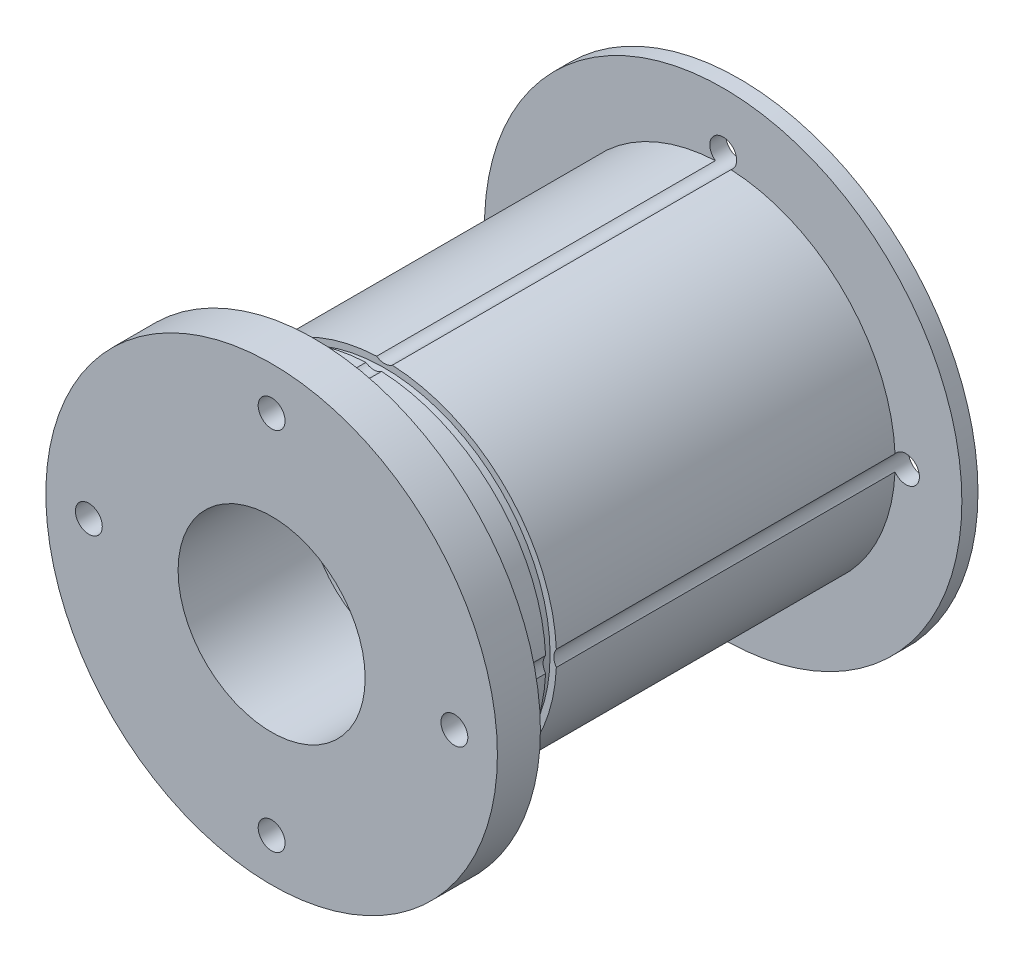
ISO-10303-21;
HEADER;
FILE_DESCRIPTION(('STEP AP214'),'2;1');
FILE_NAME('part.step','',(''),(''),'','','');
FILE_SCHEMA(('AUTOMOTIVE_DESIGN { 1 0 10303 214 1 1 1 1 }'));
ENDSEC;
DATA;
#1=APPLICATION_CONTEXT('core data for automotive mechanical design processes');
#2=APPLICATION_PROTOCOL_DEFINITION('international standard','automotive_design',2000,#1);
#3=PRODUCT_CONTEXT('',#1,'mechanical');
#4=PRODUCT('Part','Part','',(#3));
#5=PRODUCT_RELATED_PRODUCT_CATEGORY('part','',(#4));
#6=PRODUCT_DEFINITION_FORMATION('','',#4);
#7=PRODUCT_DEFINITION_CONTEXT('part definition',#1,'design');
#8=PRODUCT_DEFINITION('design','',#6,#7);
#9=PRODUCT_DEFINITION_SHAPE('','',#8);
#10=(LENGTH_UNIT() NAMED_UNIT(*) SI_UNIT(.MILLI.,.METRE.));
#11=(NAMED_UNIT(*) PLANE_ANGLE_UNIT() SI_UNIT($,.RADIAN.));
#12=(NAMED_UNIT(*) SI_UNIT($,.STERADIAN.) SOLID_ANGLE_UNIT());
#13=UNCERTAINTY_MEASURE_WITH_UNIT(LENGTH_MEASURE(1.E-05),#10,'distance_accuracy_value','');
#14=(GEOMETRIC_REPRESENTATION_CONTEXT(3) GLOBAL_UNCERTAINTY_ASSIGNED_CONTEXT((#13)) GLOBAL_UNIT_ASSIGNED_CONTEXT((#10,
#11,#12)) REPRESENTATION_CONTEXT('',''));
#15=CARTESIAN_POINT('',(0.,0.,0.));
#16=DIRECTION('',(0.,0.,1.));
#17=DIRECTION('',(1.,0.,0.));
#18=AXIS2_PLACEMENT_3D('',#15,#16,#17);
#19=CARTESIAN_POINT('',(0.,0.,23.));
#20=DIRECTION('',(0.,0.,-1.));
#21=DIRECTION('',(-1.,0.,0.));
#22=AXIS2_PLACEMENT_3D('',#19,#20,#21);
#23=CYLINDRICAL_SURFACE('',#22,16.);
#24=CARTESIAN_POINT('',(0.,0.,-15.));
#25=DIRECTION('',(0.,0.,1.));
#26=DIRECTION('',(1.,0.,0.));
#27=AXIS2_PLACEMENT_3D('',#24,#25,#26);
#28=CIRCLE('',#27,16.);
#29=CARTESIAN_POINT('',(0.727418763077474,-15.9834558823529,-15.));
#30=VERTEX_POINT('',#29);
#31=CARTESIAN_POINT('',(15.9834558823529,-0.727418763077469,-15.));
#32=VERTEX_POINT('',#31);
#33=EDGE_CURVE('E238',#30,#32,#28,.T.);
#34=ORIENTED_EDGE('',*,*,#33,.T.);
#35=DIRECTION('',(0.,0.,1.));
#36=VECTOR('',#35,1.);
#37=CARTESIAN_POINT('',(15.9834558823529,-0.727418763077475,0.));
#38=LINE('',#37,#36);
#39=CARTESIAN_POINT('',(15.9834558823529,-0.727418763077475,16.5));
#40=VERTEX_POINT('',#39);
#41=EDGE_CURVE('E232',#32,#40,#38,.T.);
#42=ORIENTED_EDGE('',*,*,#41,.T.);
#43=CARTESIAN_POINT('',(0.,0.,16.5));
#44=DIRECTION('',(0.,0.,1.));
#45=DIRECTION('',(1.,0.,0.));
#46=AXIS2_PLACEMENT_3D('',#43,#44,#45);
#47=CIRCLE('',#46,16.);
#48=CARTESIAN_POINT('',(0.727418763077472,-15.9834558823529,16.5));
#49=VERTEX_POINT('',#48);
#50=EDGE_CURVE('E184',#49,#40,#47,.T.);
#51=ORIENTED_EDGE('',*,*,#50,.F.);
#52=DIRECTION('',(0.,0.,1.));
#53=VECTOR('',#52,1.);
#54=CARTESIAN_POINT('',(0.727418763077471,-15.9834558823529,0.));
#55=LINE('',#54,#53);
#56=EDGE_CURVE('E157',#49,#30,#55,.F.);
#57=ORIENTED_EDGE('',*,*,#56,.T.);
#58=EDGE_LOOP('',(#34,#42,#51,#57));
#59=FACE_BOUND('',#58,.T.);
#60=ADVANCED_FACE('F38',(#59),#23,.T.);
#61=CARTESIAN_POINT('',(15.9834558823529,0.727418763077475,16.5));
#62=VERTEX_POINT('',#61);
#63=CARTESIAN_POINT('',(0.727418763077476,15.9834558823529,16.5));
#64=VERTEX_POINT('',#63);
#65=EDGE_CURVE('E189',#62,#64,#47,.T.);
#66=ORIENTED_EDGE('',*,*,#65,.F.);
#67=DIRECTION('',(0.,0.,1.));
#68=VECTOR('',#67,1.);
#69=CARTESIAN_POINT('',(15.9834558823529,0.727418763077475,0.));
#70=LINE('',#69,#68);
#71=CARTESIAN_POINT('',(15.9834558823529,0.727418763077473,-15.));
#72=VERTEX_POINT('',#71);
#73=EDGE_CURVE('E234',#62,#72,#70,.F.);
#74=ORIENTED_EDGE('',*,*,#73,.T.);
#75=CARTESIAN_POINT('',(0.727418763077473,15.9834558823529,-15.));
#76=VERTEX_POINT('',#75);
#77=EDGE_CURVE('E224',#72,#76,#28,.T.);
#78=ORIENTED_EDGE('',*,*,#77,.T.);
#79=DIRECTION('',(0.,0.,1.));
#80=VECTOR('',#79,1.);
#81=CARTESIAN_POINT('',(0.727418763077475,15.9834558823529,0.));
#82=LINE('',#81,#80);
#83=EDGE_CURVE('E213',#76,#64,#82,.T.);
#84=ORIENTED_EDGE('',*,*,#83,.T.);
#85=EDGE_LOOP('',(#66,#74,#78,#84));
#86=FACE_BOUND('',#85,.T.);
#87=ADVANCED_FACE('F221',(#86),#23,.T.);
#88=CARTESIAN_POINT('',(-0.727418763077474,15.9834558823529,16.5));
#89=VERTEX_POINT('',#88);
#90=CARTESIAN_POINT('',(-15.9834558823529,0.727418763077477,16.5));
#91=VERTEX_POINT('',#90);
#92=EDGE_CURVE('E183',#89,#91,#47,.T.);
#93=ORIENTED_EDGE('',*,*,#92,.F.);
#94=DIRECTION('',(0.,0.,1.));
#95=VECTOR('',#94,1.);
#96=CARTESIAN_POINT('',(-0.727418763077473,15.9834558823529,0.));
#97=LINE('',#96,#95);
#98=CARTESIAN_POINT('',(-0.727418763077472,15.9834558823529,-15.));
#99=VERTEX_POINT('',#98);
#100=EDGE_CURVE('E216',#89,#99,#97,.F.);
#101=ORIENTED_EDGE('',*,*,#100,.T.);
#102=CARTESIAN_POINT('',(-15.9834558823529,0.727418763077477,-15.));
#103=VERTEX_POINT('',#102);
#104=EDGE_CURVE('E319',#99,#103,#28,.T.);
#105=ORIENTED_EDGE('',*,*,#104,.T.);
#106=DIRECTION('',(0.,0.,1.));
#107=VECTOR('',#106,1.);
#108=CARTESIAN_POINT('',(-15.9834558823529,0.727418763077477,0.));
#109=LINE('',#108,#107);
#110=EDGE_CURVE('E439',#103,#91,#109,.T.);
#111=ORIENTED_EDGE('',*,*,#110,.T.);
#112=EDGE_LOOP('',(#93,#101,#105,#111));
#113=FACE_BOUND('',#112,.T.);
#114=ADVANCED_FACE('F367',(#113),#23,.T.);
#115=CARTESIAN_POINT('',(0.,0.,17.5));
#116=DIRECTION('',(0.,0.,1.));
#117=DIRECTION('',(1.,0.,0.));
#118=AXIS2_PLACEMENT_3D('',#115,#116,#117);
#119=CIRCLE('',#118,16.);
#120=CARTESIAN_POINT('',(0.727418763077472,-15.9834558823529,17.5));
#121=VERTEX_POINT('',#120);
#122=CARTESIAN_POINT('',(15.9834558823529,-0.727418763077475,17.5));
#123=VERTEX_POINT('',#122);
#124=EDGE_CURVE('E196',#121,#123,#119,.T.);
#125=ORIENTED_EDGE('',*,*,#124,.T.);
#126=DIRECTION('',(0.,0.,1.));
#127=VECTOR('',#126,1.);
#128=CARTESIAN_POINT('',(15.9834558823529,-0.727418763077475,0.));
#129=LINE('',#128,#127);
#130=CARTESIAN_POINT('',(15.9834558823529,-0.727418763077469,23.));
#131=VERTEX_POINT('',#130);
#132=EDGE_CURVE('E54',#123,#131,#129,.T.);
#133=ORIENTED_EDGE('',*,*,#132,.T.);
#134=CARTESIAN_POINT('',(0.,0.,23.));
#135=DIRECTION('',(0.,0.,1.));
#136=DIRECTION('',(1.,0.,0.));
#137=AXIS2_PLACEMENT_3D('',#134,#135,#136);
#138=CIRCLE('',#137,16.);
#139=CARTESIAN_POINT('',(0.727418763077474,-15.9834558823529,23.));
#140=VERTEX_POINT('',#139);
#141=EDGE_CURVE('E318',#140,#131,#138,.T.);
#142=ORIENTED_EDGE('',*,*,#141,.F.);
#143=DIRECTION('',(0.,0.,1.));
#144=VECTOR('',#143,1.);
#145=CARTESIAN_POINT('',(0.727418763077471,-15.9834558823529,0.));
#146=LINE('',#145,#144);
#147=EDGE_CURVE('E412',#140,#121,#146,.F.);
#148=ORIENTED_EDGE('',*,*,#147,.T.);
#149=EDGE_LOOP('',(#125,#133,#142,#148));
#150=FACE_BOUND('',#149,.T.);
#151=ADVANCED_FACE('F385',(#150),#23,.T.);
#152=CARTESIAN_POINT('',(15.9834558823529,0.727418763077473,23.));
#153=VERTEX_POINT('',#152);
#154=CARTESIAN_POINT('',(0.727418763077473,15.9834558823529,23.));
#155=VERTEX_POINT('',#154);
#156=EDGE_CURVE('E164',#153,#155,#138,.T.);
#157=ORIENTED_EDGE('',*,*,#156,.F.);
#158=DIRECTION('',(0.,0.,1.));
#159=VECTOR('',#158,1.);
#160=CARTESIAN_POINT('',(15.9834558823529,0.727418763077475,0.));
#161=LINE('',#160,#159);
#162=CARTESIAN_POINT('',(15.9834558823529,0.727418763077475,17.5));
#163=VERTEX_POINT('',#162);
#164=EDGE_CURVE('E254',#153,#163,#161,.F.);
#165=ORIENTED_EDGE('',*,*,#164,.T.);
#166=CARTESIAN_POINT('',(0.727418763077476,15.9834558823529,17.5));
#167=VERTEX_POINT('',#166);
#168=EDGE_CURVE('E199',#163,#167,#119,.T.);
#169=ORIENTED_EDGE('',*,*,#168,.T.);
#170=DIRECTION('',(0.,0.,1.));
#171=VECTOR('',#170,1.);
#172=CARTESIAN_POINT('',(0.727418763077475,15.9834558823529,0.));
#173=LINE('',#172,#171);
#174=EDGE_CURVE('E462',#167,#155,#173,.T.);
#175=ORIENTED_EDGE('',*,*,#174,.T.);
#176=EDGE_LOOP('',(#157,#165,#169,#175));
#177=FACE_BOUND('',#176,.T.);
#178=ADVANCED_FACE('F380',(#177),#23,.T.);
#179=CARTESIAN_POINT('',(-0.727418763077472,15.9834558823529,23.));
#180=VERTEX_POINT('',#179);
#181=CARTESIAN_POINT('',(-15.9834558823529,0.727418763077477,23.));
#182=VERTEX_POINT('',#181);
#183=EDGE_CURVE('E323',#180,#182,#138,.T.);
#184=ORIENTED_EDGE('',*,*,#183,.F.);
#185=DIRECTION('',(0.,0.,1.));
#186=VECTOR('',#185,1.);
#187=CARTESIAN_POINT('',(-0.727418763077473,15.9834558823529,0.));
#188=LINE('',#187,#186);
#189=CARTESIAN_POINT('',(-0.727418763077474,15.9834558823529,17.5));
#190=VERTEX_POINT('',#189);
#191=EDGE_CURVE('E392',#180,#190,#188,.F.);
#192=ORIENTED_EDGE('',*,*,#191,.T.);
#193=CARTESIAN_POINT('',(-15.9834558823529,0.727418763077477,17.5));
#194=VERTEX_POINT('',#193);
#195=EDGE_CURVE('E203',#190,#194,#119,.T.);
#196=ORIENTED_EDGE('',*,*,#195,.T.);
#197=DIRECTION('',(0.,0.,1.));
#198=VECTOR('',#197,1.);
#199=CARTESIAN_POINT('',(-15.9834558823529,0.727418763077477,0.));
#200=LINE('',#199,#198);
#201=EDGE_CURVE('E394',#194,#182,#200,.T.);
#202=ORIENTED_EDGE('',*,*,#201,.T.);
#203=EDGE_LOOP('',(#184,#192,#196,#202));
#204=FACE_BOUND('',#203,.T.);
#205=ADVANCED_FACE('F376',(#204),#23,.T.);
#206=CARTESIAN_POINT('',(-15.9834558823529,-0.727418763077473,16.5));
#207=VERTEX_POINT('',#206);
#208=CARTESIAN_POINT('',(-0.727418763077478,-15.9834558823529,16.5));
#209=VERTEX_POINT('',#208);
#210=EDGE_CURVE('E171',#207,#209,#47,.T.);
#211=ORIENTED_EDGE('',*,*,#210,.F.);
#212=DIRECTION('',(0.,0.,1.));
#213=VECTOR('',#212,1.);
#214=CARTESIAN_POINT('',(-15.9834558823529,-0.727418763077473,0.));
#215=LINE('',#214,#213);
#216=CARTESIAN_POINT('',(-15.9834558823529,-0.727418763077475,-15.));
#217=VERTEX_POINT('',#216);
#218=EDGE_CURVE('E786',#207,#217,#215,.F.);
#219=ORIENTED_EDGE('',*,*,#218,.T.);
#220=CARTESIAN_POINT('',(-0.727418763077468,-15.9834558823529,-15.));
#221=VERTEX_POINT('',#220);
#222=EDGE_CURVE('E173',#217,#221,#28,.T.);
#223=ORIENTED_EDGE('',*,*,#222,.T.);
#224=DIRECTION('',(0.,0.,1.));
#225=VECTOR('',#224,1.);
#226=CARTESIAN_POINT('',(-0.727418763077477,-15.9834558823529,0.));
#227=LINE('',#226,#225);
#228=EDGE_CURVE('E154',#221,#209,#227,.T.);
#229=ORIENTED_EDGE('',*,*,#228,.T.);
#230=EDGE_LOOP('',(#211,#219,#223,#229));
#231=FACE_BOUND('',#230,.T.);
#232=ADVANCED_FACE('F169',(#231),#23,.T.);
#233=CARTESIAN_POINT('',(0.,0.,23.));
#234=DIRECTION('',(0.,0.,-1.));
#235=DIRECTION('',(-1.,0.,0.));
#236=AXIS2_PLACEMENT_3D('',#233,#234,#235);
#237=CYLINDRICAL_SURFACE('',#236,8.7);
#238=CARTESIAN_POINT('',(0.,0.,-10.));
#239=DIRECTION('',(0.,0.,1.));
#240=DIRECTION('',(1.,0.,0.));
#241=AXIS2_PLACEMENT_3D('',#238,#239,#240);
#242=CIRCLE('',#241,8.7);
#243=CARTESIAN_POINT('',(8.7,0.,-10.));
#244=VERTEX_POINT('',#243);
#245=EDGE_CURVE('E291',#244,#244,#242,.T.);
#246=ORIENTED_EDGE('',*,*,#245,.F.);
#247=EDGE_LOOP('',(#246));
#248=FACE_BOUND('',#247,.T.);
#249=CARTESIAN_POINT('',(0.,0.,10.));
#250=DIRECTION('',(0.,0.,1.));
#251=DIRECTION('',(1.,0.,0.));
#252=AXIS2_PLACEMENT_3D('',#249,#250,#251);
#253=CIRCLE('',#252,8.7);
#254=CARTESIAN_POINT('',(8.7,0.,10.));
#255=VERTEX_POINT('',#254);
#256=EDGE_CURVE('E283',#255,#255,#253,.T.);
#257=ORIENTED_EDGE('',*,*,#256,.T.);
#258=EDGE_LOOP('',(#257));
#259=FACE_BOUND('',#258,.T.);
#260=ADVANCED_FACE('F341',(#248,#259),#237,.F.);
#261=CARTESIAN_POINT('',(-15.9834558823529,-0.727418763077475,23.));
#262=VERTEX_POINT('',#261);
#263=CARTESIAN_POINT('',(-0.727418763077468,-15.9834558823529,23.));
#264=VERTEX_POINT('',#263);
#265=EDGE_CURVE('E398',#262,#264,#138,.T.);
#266=ORIENTED_EDGE('',*,*,#265,.F.);
#267=DIRECTION('',(0.,0.,1.));
#268=VECTOR('',#267,1.);
#269=CARTESIAN_POINT('',(-15.9834558823529,-0.727418763077473,0.));
#270=LINE('',#269,#268);
#271=CARTESIAN_POINT('',(-15.9834558823529,-0.727418763077473,17.5));
#272=VERTEX_POINT('',#271);
#273=EDGE_CURVE('E433',#262,#272,#270,.F.);
#274=ORIENTED_EDGE('',*,*,#273,.T.);
#275=CARTESIAN_POINT('',(-0.727418763077478,-15.9834558823529,17.5));
#276=VERTEX_POINT('',#275);
#277=EDGE_CURVE('E416',#272,#276,#119,.T.);
#278=ORIENTED_EDGE('',*,*,#277,.T.);
#279=DIRECTION('',(0.,0.,1.));
#280=VECTOR('',#279,1.);
#281=CARTESIAN_POINT('',(-0.727418763077477,-15.9834558823529,0.));
#282=LINE('',#281,#280);
#283=EDGE_CURVE('E62',#276,#264,#282,.T.);
#284=ORIENTED_EDGE('',*,*,#283,.T.);
#285=EDGE_LOOP('',(#266,#274,#278,#284));
#286=FACE_BOUND('',#285,.T.);
#287=ADVANCED_FACE('F40',(#286),#23,.T.);
#288=CARTESIAN_POINT('',(0.,0.,15.));
#289=DIRECTION('',(0.,0.,1.));
#290=DIRECTION('',(1.,0.,0.));
#291=AXIS2_PLACEMENT_3D('',#288,#289,#290);
#292=CIRCLE('',#291,8.7);
#293=CARTESIAN_POINT('',(8.7,0.,15.));
#294=VERTEX_POINT('',#293);
#295=EDGE_CURVE('E197',#294,#294,#292,.T.);
#296=ORIENTED_EDGE('',*,*,#295,.F.);
#297=EDGE_LOOP('',(#296));
#298=FACE_BOUND('',#297,.T.);
#299=CARTESIAN_POINT('',(0.,0.,27.));
#300=DIRECTION('',(0.,0.,1.));
#301=DIRECTION('',(1.,0.,0.));
#302=AXIS2_PLACEMENT_3D('',#299,#300,#301);
#303=CIRCLE('',#302,8.7);
#304=CARTESIAN_POINT('',(8.7,0.,27.));
#305=VERTEX_POINT('',#304);
#306=EDGE_CURVE('E292',#305,#305,#303,.T.);
#307=ORIENTED_EDGE('',*,*,#306,.T.);
#308=EDGE_LOOP('',(#307));
#309=FACE_BOUND('',#308,.T.);
#310=ADVANCED_FACE('F337',(#298,#309),#237,.F.);
#311=CARTESIAN_POINT('',(0.,0.,-15.));
#312=DIRECTION('',(0.,0.,1.));
#313=DIRECTION('',(1.,0.,0.));
#314=AXIS2_PLACEMENT_3D('',#311,#312,#313);
#315=PLANE('',#314);
#316=CARTESIAN_POINT('',(17.,0.,-15.));
#317=DIRECTION('',(0.,0.,1.));
#318=DIRECTION('',(1.,0.,0.));
#319=AXIS2_PLACEMENT_3D('',#316,#317,#318);
#320=CIRCLE('',#319,1.25);
#321=EDGE_CURVE('E240',#32,#72,#320,.T.);
#322=ORIENTED_EDGE('',*,*,#321,.F.);
#323=ORIENTED_EDGE('',*,*,#33,.F.);
#324=CARTESIAN_POINT('',(0.,-17.,-15.));
#325=DIRECTION('',(0.,0.,1.));
#326=DIRECTION('',(1.,0.,0.));
#327=AXIS2_PLACEMENT_3D('',#324,#325,#326);
#328=CIRCLE('',#327,1.25);
#329=EDGE_CURVE('E175',#221,#30,#328,.T.);
#330=ORIENTED_EDGE('',*,*,#329,.F.);
#331=ORIENTED_EDGE('',*,*,#222,.F.);
#332=CARTESIAN_POINT('',(-17.,0.,-15.));
#333=DIRECTION('',(0.,0.,1.));
#334=DIRECTION('',(1.,0.,0.));
#335=AXIS2_PLACEMENT_3D('',#332,#333,#334);
#336=CIRCLE('',#335,1.25);
#337=EDGE_CURVE('E434',#103,#217,#336,.T.);
#338=ORIENTED_EDGE('',*,*,#337,.F.);
#339=ORIENTED_EDGE('',*,*,#104,.F.);
#340=CARTESIAN_POINT('',(0.,17.,-15.));
#341=DIRECTION('',(0.,0.,1.));
#342=DIRECTION('',(1.,0.,0.));
#343=AXIS2_PLACEMENT_3D('',#340,#341,#342);
#344=CIRCLE('',#343,1.25);
#345=EDGE_CURVE('E226',#76,#99,#344,.T.);
#346=ORIENTED_EDGE('',*,*,#345,.F.);
#347=ORIENTED_EDGE('',*,*,#77,.F.);
#348=EDGE_LOOP('',(#322,#323,#330,#331,#338,#339,#346,#347));
#349=FACE_BOUND('',#348,.T.);
#350=CARTESIAN_POINT('',(0.,0.,-15.));
#351=DIRECTION('',(0.,0.,1.));
#352=DIRECTION('',(1.,0.,0.));
#353=AXIS2_PLACEMENT_3D('',#350,#351,#352);
#354=CIRCLE('',#353,22.2);
#355=CARTESIAN_POINT('',(22.2,0.,-15.));
#356=VERTEX_POINT('',#355);
#357=EDGE_CURVE('E309',#356,#356,#354,.T.);
#358=ORIENTED_EDGE('',*,*,#357,.T.);
#359=EDGE_LOOP('',(#358));
#360=FACE_BOUND('',#359,.T.);
#361=ADVANCED_FACE('F340',(#349,#360),#315,.T.);
#362=CARTESIAN_POINT('',(0.,0.,-16.5));
#363=DIRECTION('',(0.,0.,1.));
#364=DIRECTION('',(1.,0.,0.));
#365=AXIS2_PLACEMENT_3D('',#362,#363,#364);
#366=PLANE('',#365);
#367=CARTESIAN_POINT('',(17.,0.,-16.5));
#368=DIRECTION('',(0.,0.,1.));
#369=DIRECTION('',(1.,0.,0.));
#370=AXIS2_PLACEMENT_3D('',#367,#368,#369);
#371=CIRCLE('',#370,1.25);
#372=CARTESIAN_POINT('',(18.25,0.,-16.5));
#373=VERTEX_POINT('',#372);
#374=EDGE_CURVE('E268',#373,#373,#371,.T.);
#375=ORIENTED_EDGE('',*,*,#374,.T.);
#376=EDGE_LOOP('',(#375));
#377=FACE_BOUND('',#376,.T.);
#378=CARTESIAN_POINT('',(0.,17.,-16.5));
#379=DIRECTION('',(0.,0.,1.));
#380=DIRECTION('',(1.,0.,0.));
#381=AXIS2_PLACEMENT_3D('',#378,#379,#380);
#382=CIRCLE('',#381,1.25);
#383=CARTESIAN_POINT('',(1.25,17.,-16.5));
#384=VERTEX_POINT('',#383);
#385=EDGE_CURVE('E248',#384,#384,#382,.T.);
#386=ORIENTED_EDGE('',*,*,#385,.T.);
#387=EDGE_LOOP('',(#386));
#388=FACE_BOUND('',#387,.T.);
#389=CARTESIAN_POINT('',(-17.,0.,-16.5));
#390=DIRECTION('',(0.,0.,1.));
#391=DIRECTION('',(1.,0.,0.));
#392=AXIS2_PLACEMENT_3D('',#389,#390,#391);
#393=CIRCLE('',#392,1.25);
#394=CARTESIAN_POINT('',(-15.75,0.,-16.5));
#395=VERTEX_POINT('',#394);
#396=EDGE_CURVE('E451',#395,#395,#393,.T.);
#397=ORIENTED_EDGE('',*,*,#396,.T.);
#398=EDGE_LOOP('',(#397));
#399=FACE_BOUND('',#398,.T.);
#400=CARTESIAN_POINT('',(0.,-17.,-16.5));
#401=DIRECTION('',(0.,0.,1.));
#402=DIRECTION('',(1.,0.,0.));
#403=AXIS2_PLACEMENT_3D('',#400,#401,#402);
#404=CIRCLE('',#403,1.25);
#405=CARTESIAN_POINT('',(1.25,-17.,-16.5));
#406=VERTEX_POINT('',#405);
#407=EDGE_CURVE('E788',#406,#406,#404,.T.);
#408=ORIENTED_EDGE('',*,*,#407,.T.);
#409=EDGE_LOOP('',(#408));
#410=FACE_BOUND('',#409,.T.);
#411=CARTESIAN_POINT('',(0.,0.,-16.5));
#412=DIRECTION('',(0.,0.,1.));
#413=DIRECTION('',(1.,0.,0.));
#414=AXIS2_PLACEMENT_3D('',#411,#412,#413);
#415=CIRCLE('',#414,22.2);
#416=CARTESIAN_POINT('',(22.2,0.,-16.5));
#417=VERTEX_POINT('',#416);
#418=EDGE_CURVE('E308',#417,#417,#415,.T.);
#419=ORIENTED_EDGE('',*,*,#418,.F.);
#420=EDGE_LOOP('',(#419));
#421=FACE_BOUND('',#420,.T.);
#422=CARTESIAN_POINT('',(0.,0.,-16.5));
#423=DIRECTION('',(0.,0.,1.));
#424=DIRECTION('',(1.,0.,0.));
#425=AXIS2_PLACEMENT_3D('',#422,#423,#424);
#426=CIRCLE('',#425,13.);
#427=CARTESIAN_POINT('',(13.,0.,-16.5));
#428=VERTEX_POINT('',#427);
#429=EDGE_CURVE('E301',#428,#428,#426,.T.);
#430=ORIENTED_EDGE('',*,*,#429,.T.);
#431=EDGE_LOOP('',(#430));
#432=FACE_BOUND('',#431,.T.);
#433=ADVANCED_FACE('F475',(#377,#388,#399,#410,#421,#432),#366,.F.);
#434=CARTESIAN_POINT('',(0.,0.,-15.));
#435=DIRECTION('',(0.,0.,-1.));
#436=DIRECTION('',(-1.,0.,0.));
#437=AXIS2_PLACEMENT_3D('',#434,#435,#436);
#438=CYLINDRICAL_SURFACE('',#437,22.2);
#439=ORIENTED_EDGE('',*,*,#357,.F.);
#440=EDGE_LOOP('',(#439));
#441=FACE_BOUND('',#440,.T.);
#442=ORIENTED_EDGE('',*,*,#418,.T.);
#443=EDGE_LOOP('',(#442));
#444=FACE_BOUND('',#443,.T.);
#445=ADVANCED_FACE('F357',(#441,#444),#438,.T.);
#446=CARTESIAN_POINT('',(0.,0.,-15.));
#447=DIRECTION('',(0.,0.,-1.));
#448=DIRECTION('',(-1.,0.,0.));
#449=AXIS2_PLACEMENT_3D('',#446,#447,#448);
#450=CYLINDRICAL_SURFACE('',#449,13.);
#451=ORIENTED_EDGE('',*,*,#429,.F.);
#452=EDGE_LOOP('',(#451));
#453=FACE_BOUND('',#452,.T.);
#454=CARTESIAN_POINT('',(0.,0.,-10.));
#455=DIRECTION('',(0.,0.,1.));
#456=DIRECTION('',(1.,0.,0.));
#457=AXIS2_PLACEMENT_3D('',#454,#455,#456);
#458=CIRCLE('',#457,13.);
#459=CARTESIAN_POINT('',(13.,0.,-10.));
#460=VERTEX_POINT('',#459);
#461=EDGE_CURVE('E287',#460,#460,#458,.T.);
#462=ORIENTED_EDGE('',*,*,#461,.T.);
#463=EDGE_LOOP('',(#462));
#464=FACE_BOUND('',#463,.T.);
#465=ADVANCED_FACE('F347',(#453,#464),#450,.F.);
#466=CARTESIAN_POINT('',(0.,0.,27.));
#467=DIRECTION('',(0.,0.,1.));
#468=DIRECTION('',(1.,0.,0.));
#469=AXIS2_PLACEMENT_3D('',#466,#467,#468);
#470=PLANE('',#469);
#471=CARTESIAN_POINT('',(17.,0.,27.));
#472=DIRECTION('',(0.,0.,1.));
#473=DIRECTION('',(1.,0.,0.));
#474=AXIS2_PLACEMENT_3D('',#471,#472,#473);
#475=CIRCLE('',#474,1.25);
#476=CARTESIAN_POINT('',(18.25,0.,27.));
#477=VERTEX_POINT('',#476);
#478=EDGE_CURVE('E264',#477,#477,#475,.T.);
#479=ORIENTED_EDGE('',*,*,#478,.F.);
#480=EDGE_LOOP('',(#479));
#481=FACE_BOUND('',#480,.T.);
#482=CARTESIAN_POINT('',(0.,17.,27.));
#483=DIRECTION('',(0.,0.,1.));
#484=DIRECTION('',(1.,0.,0.));
#485=AXIS2_PLACEMENT_3D('',#482,#483,#484);
#486=CIRCLE('',#485,1.25);
#487=CARTESIAN_POINT('',(1.25,17.,27.));
#488=VERTEX_POINT('',#487);
#489=EDGE_CURVE('E468',#488,#488,#486,.T.);
#490=ORIENTED_EDGE('',*,*,#489,.F.);
#491=EDGE_LOOP('',(#490));
#492=FACE_BOUND('',#491,.T.);
#493=CARTESIAN_POINT('',(-17.,0.,27.));
#494=DIRECTION('',(0.,0.,1.));
#495=DIRECTION('',(1.,0.,0.));
#496=AXIS2_PLACEMENT_3D('',#493,#494,#495);
#497=CIRCLE('',#496,1.25);
#498=CARTESIAN_POINT('',(-15.75,0.,27.));
#499=VERTEX_POINT('',#498);
#500=EDGE_CURVE('E448',#499,#499,#497,.T.);
#501=ORIENTED_EDGE('',*,*,#500,.F.);
#502=EDGE_LOOP('',(#501));
#503=FACE_BOUND('',#502,.T.);
#504=CARTESIAN_POINT('',(0.,-17.,27.));
#505=DIRECTION('',(0.,0.,1.));
#506=DIRECTION('',(1.,0.,0.));
#507=AXIS2_PLACEMENT_3D('',#504,#505,#506);
#508=CIRCLE('',#507,1.25);
#509=CARTESIAN_POINT('',(1.25,-17.,27.));
#510=VERTEX_POINT('',#509);
#511=EDGE_CURVE('E507',#510,#510,#508,.T.);
#512=ORIENTED_EDGE('',*,*,#511,.F.);
#513=EDGE_LOOP('',(#512));
#514=FACE_BOUND('',#513,.T.);
#515=CARTESIAN_POINT('',(0.,0.,27.));
#516=DIRECTION('',(0.,0.,1.));
#517=DIRECTION('',(1.,0.,0.));
#518=AXIS2_PLACEMENT_3D('',#515,#516,#517);
#519=CIRCLE('',#518,21.);
#520=CARTESIAN_POINT('',(21.,0.,27.));
#521=VERTEX_POINT('',#520);
#522=EDGE_CURVE('E297',#521,#521,#519,.T.);
#523=ORIENTED_EDGE('',*,*,#522,.T.);
#524=EDGE_LOOP('',(#523));
#525=FACE_BOUND('',#524,.T.);
#526=ORIENTED_EDGE('',*,*,#306,.F.);
#527=EDGE_LOOP('',(#526));
#528=FACE_BOUND('',#527,.T.);
#529=ADVANCED_FACE('F344',(#481,#492,#503,#514,#525,#528),#470,.T.);
#530=CARTESIAN_POINT('',(0.,0.,23.));
#531=DIRECTION('',(0.,0.,1.));
#532=DIRECTION('',(1.,0.,0.));
#533=AXIS2_PLACEMENT_3D('',#530,#531,#532);
#534=PLANE('',#533);
#535=ORIENTED_EDGE('',*,*,#141,.T.);
#536=CARTESIAN_POINT('',(17.,0.,23.));
#537=DIRECTION('',(0.,0.,1.));
#538=DIRECTION('',(1.,0.,0.));
#539=AXIS2_PLACEMENT_3D('',#536,#537,#538);
#540=CIRCLE('',#539,1.25);
#541=EDGE_CURVE('E260',#131,#153,#540,.T.);
#542=ORIENTED_EDGE('',*,*,#541,.T.);
#543=ORIENTED_EDGE('',*,*,#156,.T.);
#544=CARTESIAN_POINT('',(0.,17.,23.));
#545=DIRECTION('',(0.,0.,1.));
#546=DIRECTION('',(1.,0.,0.));
#547=AXIS2_PLACEMENT_3D('',#544,#545,#546);
#548=CIRCLE('',#547,1.25);
#549=EDGE_CURVE('E465',#155,#180,#548,.T.);
#550=ORIENTED_EDGE('',*,*,#549,.T.);
#551=ORIENTED_EDGE('',*,*,#183,.T.);
#552=CARTESIAN_POINT('',(-17.,0.,23.));
#553=DIRECTION('',(0.,0.,1.));
#554=DIRECTION('',(1.,0.,0.));
#555=AXIS2_PLACEMENT_3D('',#552,#553,#554);
#556=CIRCLE('',#555,1.25);
#557=EDGE_CURVE('E445',#182,#262,#556,.T.);
#558=ORIENTED_EDGE('',*,*,#557,.T.);
#559=ORIENTED_EDGE('',*,*,#265,.T.);
#560=CARTESIAN_POINT('',(0.,-17.,23.));
#561=DIRECTION('',(0.,0.,1.));
#562=DIRECTION('',(1.,0.,0.));
#563=AXIS2_PLACEMENT_3D('',#560,#561,#562);
#564=CIRCLE('',#563,1.25);
#565=EDGE_CURVE('E408',#264,#140,#564,.T.);
#566=ORIENTED_EDGE('',*,*,#565,.T.);
#567=EDGE_LOOP('',(#535,#542,#543,#550,#551,#558,#559,#566));
#568=FACE_BOUND('',#567,.T.);
#569=CARTESIAN_POINT('',(0.,0.,23.));
#570=DIRECTION('',(0.,0.,1.));
#571=DIRECTION('',(1.,0.,0.));
#572=AXIS2_PLACEMENT_3D('',#569,#570,#571);
#573=CIRCLE('',#572,21.);
#574=CARTESIAN_POINT('',(21.,0.,23.));
#575=VERTEX_POINT('',#574);
#576=EDGE_CURVE('E296',#575,#575,#573,.T.);
#577=ORIENTED_EDGE('',*,*,#576,.F.);
#578=EDGE_LOOP('',(#577));
#579=FACE_BOUND('',#578,.T.);
#580=ADVANCED_FACE('F346',(#568,#579),#534,.F.);
#581=CARTESIAN_POINT('',(0.,0.,27.));
#582=DIRECTION('',(0.,0.,-1.));
#583=DIRECTION('',(-1.,0.,0.));
#584=AXIS2_PLACEMENT_3D('',#581,#582,#583);
#585=CYLINDRICAL_SURFACE('',#584,21.);
#586=ORIENTED_EDGE('',*,*,#522,.F.);
#587=EDGE_LOOP('',(#586));
#588=FACE_BOUND('',#587,.T.);
#589=ORIENTED_EDGE('',*,*,#576,.T.);
#590=EDGE_LOOP('',(#589));
#591=FACE_BOUND('',#590,.T.);
#592=ADVANCED_FACE('F354',(#588,#591),#585,.T.);
#593=CARTESIAN_POINT('',(0.,0.,-10.));
#594=DIRECTION('',(0.,0.,1.));
#595=DIRECTION('',(1.,0.,0.));
#596=AXIS2_PLACEMENT_3D('',#593,#594,#595);
#597=PLANE('',#596);
#598=ORIENTED_EDGE('',*,*,#245,.T.);
#599=EDGE_LOOP('',(#598));
#600=FACE_BOUND('',#599,.T.);
#601=ORIENTED_EDGE('',*,*,#461,.F.);
#602=EDGE_LOOP('',(#601));
#603=FACE_BOUND('',#602,.T.);
#604=ADVANCED_FACE('F512',(#600,#603),#597,.F.);
#605=CARTESIAN_POINT('',(0.,0.,15.));
#606=DIRECTION('',(0.,0.,-1.));
#607=DIRECTION('',(-1.,0.,0.));
#608=AXIS2_PLACEMENT_3D('',#605,#606,#607);
#609=CYLINDRICAL_SURFACE('',#608,13.);
#610=CARTESIAN_POINT('',(0.,0.,15.));
#611=DIRECTION('',(0.,0.,1.));
#612=DIRECTION('',(1.,0.,0.));
#613=AXIS2_PLACEMENT_3D('',#610,#611,#612);
#614=CIRCLE('',#613,13.);
#615=CARTESIAN_POINT('',(13.,0.,15.));
#616=VERTEX_POINT('',#615);
#617=EDGE_CURVE('E279',#616,#616,#614,.T.);
#618=ORIENTED_EDGE('',*,*,#617,.T.);
#619=EDGE_LOOP('',(#618));
#620=FACE_BOUND('',#619,.T.);
#621=CARTESIAN_POINT('',(0.,0.,10.));
#622=DIRECTION('',(0.,0.,1.));
#623=DIRECTION('',(1.,0.,0.));
#624=AXIS2_PLACEMENT_3D('',#621,#622,#623);
#625=CIRCLE('',#624,13.);
#626=CARTESIAN_POINT('',(13.,0.,10.));
#627=VERTEX_POINT('',#626);
#628=EDGE_CURVE('E202',#627,#627,#625,.T.);
#629=ORIENTED_EDGE('',*,*,#628,.F.);
#630=EDGE_LOOP('',(#629));
#631=FACE_BOUND('',#630,.T.);
#632=ADVANCED_FACE('F518',(#620,#631),#609,.F.);
#633=CARTESIAN_POINT('',(0.,0.,15.));
#634=DIRECTION('',(0.,0.,1.));
#635=DIRECTION('',(1.,0.,0.));
#636=AXIS2_PLACEMENT_3D('',#633,#634,#635);
#637=PLANE('',#636);
#638=ORIENTED_EDGE('',*,*,#295,.T.);
#639=EDGE_LOOP('',(#638));
#640=FACE_BOUND('',#639,.T.);
#641=ORIENTED_EDGE('',*,*,#617,.F.);
#642=EDGE_LOOP('',(#641));
#643=FACE_BOUND('',#642,.T.);
#644=ADVANCED_FACE('F334',(#640,#643),#637,.F.);
#645=CARTESIAN_POINT('',(0.,0.,10.));
#646=DIRECTION('',(0.,0.,1.));
#647=DIRECTION('',(1.,0.,0.));
#648=AXIS2_PLACEMENT_3D('',#645,#646,#647);
#649=PLANE('',#648);
#650=ORIENTED_EDGE('',*,*,#256,.F.);
#651=EDGE_LOOP('',(#650));
#652=FACE_BOUND('',#651,.T.);
#653=ORIENTED_EDGE('',*,*,#628,.T.);
#654=EDGE_LOOP('',(#653));
#655=FACE_BOUND('',#654,.T.);
#656=ADVANCED_FACE('F581',(#652,#655),#649,.T.);
#657=CARTESIAN_POINT('',(0.,0.,17.5));
#658=DIRECTION('',(0.,0.,1.));
#659=DIRECTION('',(1.,0.,0.));
#660=AXIS2_PLACEMENT_3D('',#657,#658,#659);
#661=PLANE('',#660);
#662=CARTESIAN_POINT('',(0.,0.,17.5));
#663=DIRECTION('',(0.,0.,1.));
#664=DIRECTION('',(1.,0.,0.));
#665=AXIS2_PLACEMENT_3D('',#662,#663,#664);
#666=CIRCLE('',#665,15.4);
#667=CARTESIAN_POINT('',(15.4,0.,17.5));
#668=VERTEX_POINT('',#667);
#669=EDGE_CURVE('E191',#668,#668,#666,.T.);
#670=ORIENTED_EDGE('',*,*,#669,.T.);
#671=EDGE_LOOP('',(#670));
#672=FACE_BOUND('',#671,.T.);
#673=ORIENTED_EDGE('',*,*,#168,.F.);
#674=CARTESIAN_POINT('',(17.,0.,17.5));
#675=DIRECTION('',(0.,0.,1.));
#676=DIRECTION('',(1.,0.,0.));
#677=AXIS2_PLACEMENT_3D('',#674,#675,#676);
#678=CIRCLE('',#677,1.25);
#679=EDGE_CURVE('E245',#163,#123,#678,.T.);
#680=ORIENTED_EDGE('',*,*,#679,.T.);
#681=ORIENTED_EDGE('',*,*,#124,.F.);
#682=CARTESIAN_POINT('',(0.,-17.,17.5));
#683=DIRECTION('',(0.,0.,1.));
#684=DIRECTION('',(1.,0.,0.));
#685=AXIS2_PLACEMENT_3D('',#682,#683,#684);
#686=CIRCLE('',#685,1.25);
#687=EDGE_CURVE('E800',#121,#276,#686,.T.);
#688=ORIENTED_EDGE('',*,*,#687,.T.);
#689=ORIENTED_EDGE('',*,*,#277,.F.);
#690=CARTESIAN_POINT('',(-17.,0.,17.5));
#691=DIRECTION('',(0.,0.,1.));
#692=DIRECTION('',(1.,0.,0.));
#693=AXIS2_PLACEMENT_3D('',#690,#691,#692);
#694=CIRCLE('',#693,1.25);
#695=EDGE_CURVE('E430',#272,#194,#694,.T.);
#696=ORIENTED_EDGE('',*,*,#695,.T.);
#697=ORIENTED_EDGE('',*,*,#195,.F.);
#698=CARTESIAN_POINT('',(0.,17.,17.5));
#699=DIRECTION('',(0.,0.,1.));
#700=DIRECTION('',(1.,0.,0.));
#701=AXIS2_PLACEMENT_3D('',#698,#699,#700);
#702=CIRCLE('',#701,1.25);
#703=EDGE_CURVE('E429',#190,#167,#702,.T.);
#704=ORIENTED_EDGE('',*,*,#703,.T.);
#705=EDGE_LOOP('',(#673,#680,#681,#688,#689,#696,#697,#704));
#706=FACE_BOUND('',#705,.T.);
#707=ADVANCED_FACE('F428',(#672,#706),#661,.F.);
#708=CARTESIAN_POINT('',(0.,0.,16.5));
#709=DIRECTION('',(0.,0.,1.));
#710=DIRECTION('',(1.,0.,0.));
#711=AXIS2_PLACEMENT_3D('',#708,#709,#710);
#712=PLANE('',#711);
#713=CARTESIAN_POINT('',(17.,0.,16.5));
#714=DIRECTION('',(0.,0.,1.));
#715=DIRECTION('',(1.,0.,0.));
#716=AXIS2_PLACEMENT_3D('',#713,#714,#715);
#717=CIRCLE('',#716,1.25);
#718=EDGE_CURVE('E11',#62,#40,#717,.T.);
#719=ORIENTED_EDGE('',*,*,#718,.F.);
#720=ORIENTED_EDGE('',*,*,#65,.T.);
#721=CARTESIAN_POINT('',(0.,17.,16.5));
#722=DIRECTION('',(0.,0.,1.));
#723=DIRECTION('',(1.,0.,0.));
#724=AXIS2_PLACEMENT_3D('',#721,#722,#723);
#725=CIRCLE('',#724,1.25);
#726=EDGE_CURVE('E47',#89,#64,#725,.T.);
#727=ORIENTED_EDGE('',*,*,#726,.F.);
#728=ORIENTED_EDGE('',*,*,#92,.T.);
#729=CARTESIAN_POINT('',(-17.,0.,16.5));
#730=DIRECTION('',(0.,0.,1.));
#731=DIRECTION('',(1.,0.,0.));
#732=AXIS2_PLACEMENT_3D('',#729,#730,#731);
#733=CIRCLE('',#732,1.25);
#734=EDGE_CURVE('E163',#207,#91,#733,.T.);
#735=ORIENTED_EDGE('',*,*,#734,.F.);
#736=ORIENTED_EDGE('',*,*,#210,.T.);
#737=CARTESIAN_POINT('',(0.,-17.,16.5));
#738=DIRECTION('',(0.,0.,1.));
#739=DIRECTION('',(1.,0.,0.));
#740=AXIS2_PLACEMENT_3D('',#737,#738,#739);
#741=CIRCLE('',#740,1.25);
#742=EDGE_CURVE('E150',#49,#209,#741,.T.);
#743=ORIENTED_EDGE('',*,*,#742,.F.);
#744=ORIENTED_EDGE('',*,*,#50,.T.);
#745=EDGE_LOOP('',(#719,#720,#727,#728,#735,#736,#743,#744));
#746=FACE_BOUND('',#745,.T.);
#747=CARTESIAN_POINT('',(0.,0.,16.5));
#748=DIRECTION('',(0.,0.,1.));
#749=DIRECTION('',(1.,0.,0.));
#750=AXIS2_PLACEMENT_3D('',#747,#748,#749);
#751=CIRCLE('',#750,15.4);
#752=CARTESIAN_POINT('',(15.4,0.,16.5));
#753=VERTEX_POINT('',#752);
#754=EDGE_CURVE('E272',#753,#753,#751,.T.);
#755=ORIENTED_EDGE('',*,*,#754,.F.);
#756=EDGE_LOOP('',(#755));
#757=FACE_BOUND('',#756,.T.);
#758=ADVANCED_FACE('F179',(#746,#757),#712,.T.);
#759=CARTESIAN_POINT('',(0.,0.,17.5));
#760=DIRECTION('',(0.,0.,-1.));
#761=DIRECTION('',(-1.,0.,0.));
#762=AXIS2_PLACEMENT_3D('',#759,#760,#761);
#763=CYLINDRICAL_SURFACE('',#762,15.4);
#764=ORIENTED_EDGE('',*,*,#669,.F.);
#765=EDGE_LOOP('',(#764));
#766=FACE_BOUND('',#765,.T.);
#767=ORIENTED_EDGE('',*,*,#754,.T.);
#768=EDGE_LOOP('',(#767));
#769=FACE_BOUND('',#768,.T.);
#770=ADVANCED_FACE('F605',(#766,#769),#763,.T.);
#771=CARTESIAN_POINT('',(0.,-17.,-100.));
#772=DIRECTION('',(0.,0.,1.));
#773=DIRECTION('',(1.,0.,0.));
#774=AXIS2_PLACEMENT_3D('',#771,#772,#773);
#775=CYLINDRICAL_SURFACE('',#774,1.25);
#776=ORIENTED_EDGE('',*,*,#329,.T.);
#777=ORIENTED_EDGE('',*,*,#56,.F.);
#778=ORIENTED_EDGE('',*,*,#742,.T.);
#779=ORIENTED_EDGE('',*,*,#228,.F.);
#780=EDGE_LOOP('',(#776,#777,#778,#779));
#781=FACE_BOUND('',#780,.T.);
#782=ORIENTED_EDGE('',*,*,#407,.F.);
#783=EDGE_LOOP('',(#782));
#784=FACE_BOUND('',#783,.T.);
#785=ADVANCED_FACE('F152',(#781,#784),#775,.F.);
#786=CARTESIAN_POINT('',(-17.,0.,-100.));
#787=DIRECTION('',(0.,0.,1.));
#788=DIRECTION('',(1.,0.,0.));
#789=AXIS2_PLACEMENT_3D('',#786,#787,#788);
#790=CYLINDRICAL_SURFACE('',#789,1.25);
#791=ORIENTED_EDGE('',*,*,#337,.T.);
#792=ORIENTED_EDGE('',*,*,#218,.F.);
#793=ORIENTED_EDGE('',*,*,#734,.T.);
#794=ORIENTED_EDGE('',*,*,#110,.F.);
#795=EDGE_LOOP('',(#791,#792,#793,#794));
#796=FACE_BOUND('',#795,.T.);
#797=ORIENTED_EDGE('',*,*,#396,.F.);
#798=EDGE_LOOP('',(#797));
#799=FACE_BOUND('',#798,.T.);
#800=ADVANCED_FACE('F478',(#796,#799),#790,.F.);
#801=CARTESIAN_POINT('',(0.,17.,-100.));
#802=DIRECTION('',(0.,0.,1.));
#803=DIRECTION('',(1.,0.,0.));
#804=AXIS2_PLACEMENT_3D('',#801,#802,#803);
#805=CYLINDRICAL_SURFACE('',#804,1.25);
#806=ORIENTED_EDGE('',*,*,#345,.T.);
#807=ORIENTED_EDGE('',*,*,#100,.F.);
#808=ORIENTED_EDGE('',*,*,#726,.T.);
#809=ORIENTED_EDGE('',*,*,#83,.F.);
#810=EDGE_LOOP('',(#806,#807,#808,#809));
#811=FACE_BOUND('',#810,.T.);
#812=ORIENTED_EDGE('',*,*,#385,.F.);
#813=EDGE_LOOP('',(#812));
#814=FACE_BOUND('',#813,.T.);
#815=ADVANCED_FACE('F211',(#811,#814),#805,.F.);
#816=CARTESIAN_POINT('',(17.,0.,-100.));
#817=DIRECTION('',(0.,0.,1.));
#818=DIRECTION('',(1.,0.,0.));
#819=AXIS2_PLACEMENT_3D('',#816,#817,#818);
#820=CYLINDRICAL_SURFACE('',#819,1.25);
#821=ORIENTED_EDGE('',*,*,#321,.T.);
#822=ORIENTED_EDGE('',*,*,#73,.F.);
#823=ORIENTED_EDGE('',*,*,#718,.T.);
#824=ORIENTED_EDGE('',*,*,#41,.F.);
#825=EDGE_LOOP('',(#821,#822,#823,#824));
#826=FACE_BOUND('',#825,.T.);
#827=ORIENTED_EDGE('',*,*,#374,.F.);
#828=EDGE_LOOP('',(#827));
#829=FACE_BOUND('',#828,.T.);
#830=ADVANCED_FACE('F230',(#826,#829),#820,.F.);
#831=ORIENTED_EDGE('',*,*,#511,.T.);
#832=EDGE_LOOP('',(#831));
#833=FACE_BOUND('',#832,.T.);
#834=ORIENTED_EDGE('',*,*,#283,.F.);
#835=ORIENTED_EDGE('',*,*,#687,.F.);
#836=ORIENTED_EDGE('',*,*,#147,.F.);
#837=ORIENTED_EDGE('',*,*,#565,.F.);
#838=EDGE_LOOP('',(#834,#835,#836,#837));
#839=FACE_BOUND('',#838,.T.);
#840=ADVANCED_FACE('F485',(#833,#839),#775,.F.);
#841=ORIENTED_EDGE('',*,*,#500,.T.);
#842=EDGE_LOOP('',(#841));
#843=FACE_BOUND('',#842,.T.);
#844=ORIENTED_EDGE('',*,*,#201,.F.);
#845=ORIENTED_EDGE('',*,*,#695,.F.);
#846=ORIENTED_EDGE('',*,*,#273,.F.);
#847=ORIENTED_EDGE('',*,*,#557,.F.);
#848=EDGE_LOOP('',(#844,#845,#846,#847));
#849=FACE_BOUND('',#848,.T.);
#850=ADVANCED_FACE('F490',(#843,#849),#790,.F.);
#851=ORIENTED_EDGE('',*,*,#489,.T.);
#852=EDGE_LOOP('',(#851));
#853=FACE_BOUND('',#852,.T.);
#854=ORIENTED_EDGE('',*,*,#174,.F.);
#855=ORIENTED_EDGE('',*,*,#703,.F.);
#856=ORIENTED_EDGE('',*,*,#191,.F.);
#857=ORIENTED_EDGE('',*,*,#549,.F.);
#858=EDGE_LOOP('',(#854,#855,#856,#857));
#859=FACE_BOUND('',#858,.T.);
#860=ADVANCED_FACE('F480',(#853,#859),#805,.F.);
#861=ORIENTED_EDGE('',*,*,#478,.T.);
#862=EDGE_LOOP('',(#861));
#863=FACE_BOUND('',#862,.T.);
#864=ORIENTED_EDGE('',*,*,#132,.F.);
#865=ORIENTED_EDGE('',*,*,#679,.F.);
#866=ORIENTED_EDGE('',*,*,#164,.F.);
#867=ORIENTED_EDGE('',*,*,#541,.F.);
#868=EDGE_LOOP('',(#864,#865,#866,#867));
#869=FACE_BOUND('',#868,.T.);
#870=ADVANCED_FACE('F487',(#863,#869),#820,.F.);
#871=CLOSED_SHELL('',(#60,#87,#114,#151,#178,#205,#232,#260,#287,#310,#361,#433,#445,#465,#529,
#580,#592,#604,#632,#644,#656,#707,#758,#770,#785,#800,#815,#830,#840,#850,#860,#870));
#872=MANIFOLD_SOLID_BREP('B2',#871);
#873=ADVANCED_BREP_SHAPE_REPRESENTATION('',(#18,#872),#14);
#874=SHAPE_DEFINITION_REPRESENTATION(#9,#873);
ENDSEC;
END-ISO-10303-21;
